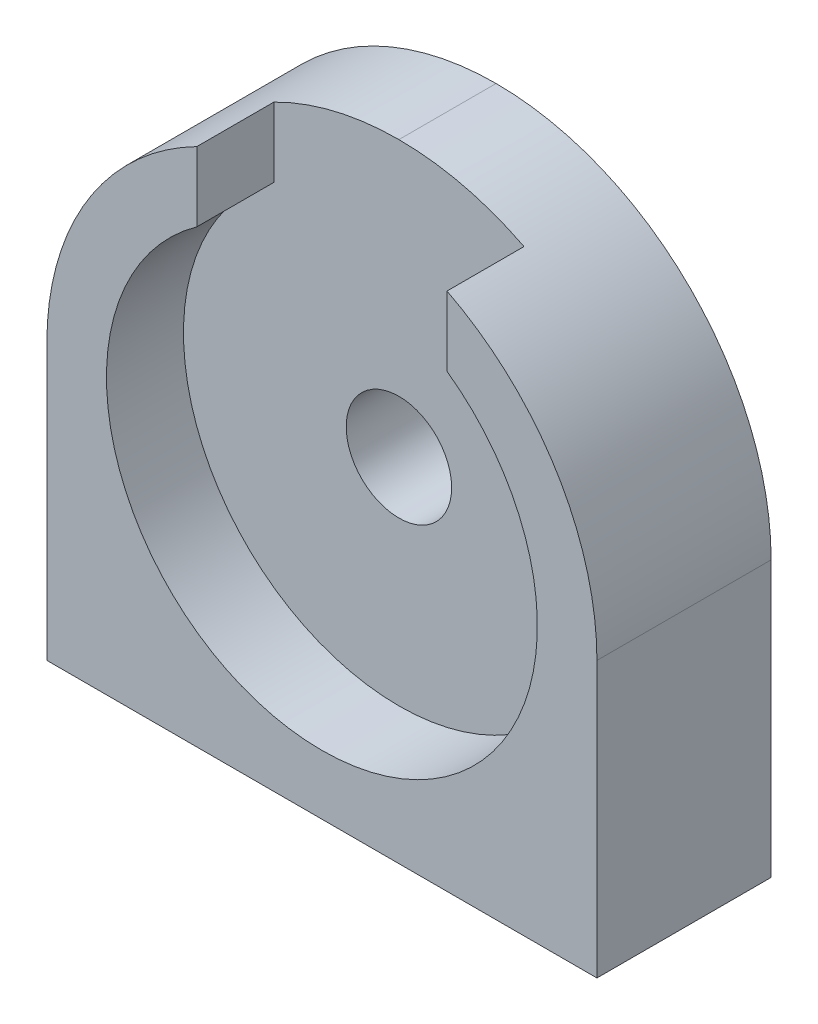
ISO-10303-21;
HEADER;
FILE_DESCRIPTION(('STEP AP214'),'2;1');
FILE_NAME('part.step','',(''),(''),'','','');
FILE_SCHEMA(('AUTOMOTIVE_DESIGN { 1 0 10303 214 1 1 1 1 }'));
ENDSEC;
DATA;
#1=APPLICATION_CONTEXT('core data for automotive mechanical design processes');
#2=APPLICATION_PROTOCOL_DEFINITION('international standard','automotive_design',2000,#1);
#3=PRODUCT_CONTEXT('',#1,'mechanical');
#4=PRODUCT('Part','Part','',(#3));
#5=PRODUCT_RELATED_PRODUCT_CATEGORY('part','',(#4));
#6=PRODUCT_DEFINITION_FORMATION('','',#4);
#7=PRODUCT_DEFINITION_CONTEXT('part definition',#1,'design');
#8=PRODUCT_DEFINITION('design','',#6,#7);
#9=PRODUCT_DEFINITION_SHAPE('','',#8);
#10=(LENGTH_UNIT() NAMED_UNIT(*) SI_UNIT(.MILLI.,.METRE.));
#11=(NAMED_UNIT(*) PLANE_ANGLE_UNIT() SI_UNIT($,.RADIAN.));
#12=(NAMED_UNIT(*) SI_UNIT($,.STERADIAN.) SOLID_ANGLE_UNIT());
#13=UNCERTAINTY_MEASURE_WITH_UNIT(LENGTH_MEASURE(1.E-05),#10,'distance_accuracy_value','');
#14=(GEOMETRIC_REPRESENTATION_CONTEXT(3) GLOBAL_UNCERTAINTY_ASSIGNED_CONTEXT((#13)) GLOBAL_UNIT_ASSIGNED_CONTEXT((#10,
#11,#12)) REPRESENTATION_CONTEXT('',''));
#15=CARTESIAN_POINT('',(0.,0.,0.));
#16=DIRECTION('',(0.,0.,1.));
#17=DIRECTION('',(1.,0.,0.));
#18=AXIS2_PLACEMENT_3D('',#15,#16,#17);
#19=CARTESIAN_POINT('',(0.,0.,25.146));
#20=DIRECTION('',(1.,0.,0.));
#21=DIRECTION('',(0.,0.,-1.));
#22=AXIS2_PLACEMENT_3D('',#19,#20,#21);
#23=PLANE('',#22);
#24=DIRECTION('',(0.,0.,-1.));
#25=VECTOR('',#24,1.);
#26=CARTESIAN_POINT('',(0.,0.,25.146));
#27=LINE('',#26,#25);
#28=CARTESIAN_POINT('',(0.,0.,4.826));
#29=VERTEX_POINT('',#28);
#30=CARTESIAN_POINT('',(0.,0.,0.));
#31=VERTEX_POINT('',#30);
#32=EDGE_CURVE('E117',#29,#31,#27,.T.);
#33=ORIENTED_EDGE('',*,*,#32,.F.);
#34=DIRECTION('',(0.,-1.,0.));
#35=VECTOR('',#34,1.);
#36=CARTESIAN_POINT('',(0.,0.,4.826));
#37=LINE('',#36,#35);
#38=CARTESIAN_POINT('',(0.,7.62,4.826));
#39=VERTEX_POINT('',#38);
#40=EDGE_CURVE('E102',#39,#29,#37,.T.);
#41=ORIENTED_EDGE('',*,*,#40,.F.);
#42=DIRECTION('',(0.,0.,-1.));
#43=VECTOR('',#42,1.);
#44=CARTESIAN_POINT('',(0.,7.62,25.146));
#45=LINE('',#44,#43);
#46=CARTESIAN_POINT('',(0.,7.62,0.));
#47=VERTEX_POINT('',#46);
#48=EDGE_CURVE('E136',#39,#47,#45,.T.);
#49=ORIENTED_EDGE('',*,*,#48,.T.);
#50=DIRECTION('',(0.,-1.,0.));
#51=VECTOR('',#50,1.);
#52=CARTESIAN_POINT('',(0.,0.,0.));
#53=LINE('',#52,#51);
#54=EDGE_CURVE('E122',#47,#31,#53,.T.);
#55=ORIENTED_EDGE('',*,*,#54,.T.);
#56=EDGE_LOOP('',(#33,#41,#49,#55));
#57=FACE_BOUND('',#56,.T.);
#58=ADVANCED_FACE('F34',(#57),#23,.F.);
#59=CARTESIAN_POINT('',(0.,0.,25.146));
#60=DIRECTION('',(0.,1.,0.));
#61=DIRECTION('',(0.,0.,1.));
#62=AXIS2_PLACEMENT_3D('',#59,#60,#61);
#63=PLANE('',#62);
#64=DIRECTION('',(0.,0.,-1.));
#65=VECTOR('',#64,1.);
#66=CARTESIAN_POINT('',(15.24,0.,25.146));
#67=LINE('',#66,#65);
#68=CARTESIAN_POINT('',(15.24,0.,4.826));
#69=VERTEX_POINT('',#68);
#70=CARTESIAN_POINT('',(15.24,0.,0.));
#71=VERTEX_POINT('',#70);
#72=EDGE_CURVE('E119',#69,#71,#67,.T.);
#73=ORIENTED_EDGE('',*,*,#72,.F.);
#74=DIRECTION('',(1.,0.,0.));
#75=VECTOR('',#74,1.);
#76=CARTESIAN_POINT('',(0.,0.,4.826));
#77=LINE('',#76,#75);
#78=EDGE_CURVE('E105',#29,#69,#77,.T.);
#79=ORIENTED_EDGE('',*,*,#78,.F.);
#80=ORIENTED_EDGE('',*,*,#32,.T.);
#81=DIRECTION('',(1.,0.,0.));
#82=VECTOR('',#81,1.);
#83=CARTESIAN_POINT('',(0.,0.,0.));
#84=LINE('',#83,#82);
#85=EDGE_CURVE('E183',#31,#71,#84,.T.);
#86=ORIENTED_EDGE('',*,*,#85,.T.);
#87=EDGE_LOOP('',(#73,#79,#80,#86));
#88=FACE_BOUND('',#87,.T.);
#89=ADVANCED_FACE('F115',(#88),#63,.F.);
#90=CARTESIAN_POINT('',(15.24,0.,25.146));
#91=DIRECTION('',(-1.,0.,0.));
#92=DIRECTION('',(0.,0.,1.));
#93=AXIS2_PLACEMENT_3D('',#90,#91,#92);
#94=PLANE('',#93);
#95=DIRECTION('',(0.,0.,-1.));
#96=VECTOR('',#95,1.);
#97=CARTESIAN_POINT('',(15.24,7.62,25.146));
#98=LINE('',#97,#96);
#99=CARTESIAN_POINT('',(15.24,7.62,0.));
#100=VERTEX_POINT('',#99);
#101=CARTESIAN_POINT('',(15.24,7.62,4.826));
#102=VERTEX_POINT('',#101);
#103=EDGE_CURVE('E133',#100,#102,#98,.F.);
#104=ORIENTED_EDGE('',*,*,#103,.T.);
#105=DIRECTION('',(0.,-1.,0.));
#106=VECTOR('',#105,1.);
#107=CARTESIAN_POINT('',(15.24,0.,4.826));
#108=LINE('',#107,#106);
#109=EDGE_CURVE('E165',#102,#69,#108,.T.);
#110=ORIENTED_EDGE('',*,*,#109,.T.);
#111=ORIENTED_EDGE('',*,*,#72,.T.);
#112=DIRECTION('',(0.,1.,0.));
#113=VECTOR('',#112,1.);
#114=CARTESIAN_POINT('',(15.24,0.,0.));
#115=LINE('',#114,#113);
#116=EDGE_CURVE('E128',#71,#100,#115,.T.);
#117=ORIENTED_EDGE('',*,*,#116,.T.);
#118=EDGE_LOOP('',(#104,#110,#111,#117));
#119=FACE_BOUND('',#118,.T.);
#120=ADVANCED_FACE('F188',(#119),#94,.F.);
#121=CARTESIAN_POINT('',(0.,0.,0.));
#122=DIRECTION('',(0.,0.,-1.));
#123=DIRECTION('',(-1.,0.,0.));
#124=AXIS2_PLACEMENT_3D('',#121,#122,#123);
#125=PLANE('',#124);
#126=CARTESIAN_POINT('',(7.62,7.61999999999998,0.));
#127=DIRECTION('',(0.,0.,1.));
#128=DIRECTION('',(1.,0.,0.));
#129=AXIS2_PLACEMENT_3D('',#126,#127,#128);
#130=CIRCLE('',#129,1.4605);
#131=CARTESIAN_POINT('',(9.0805,7.61999999999998,0.));
#132=VERTEX_POINT('',#131);
#133=EDGE_CURVE('E163',#132,#132,#130,.T.);
#134=ORIENTED_EDGE('',*,*,#133,.T.);
#135=EDGE_LOOP('',(#134));
#136=FACE_BOUND('',#135,.T.);
#137=CARTESIAN_POINT('',(7.62,7.62,0.));
#138=DIRECTION('',(0.,0.,-1.));
#139=DIRECTION('',(-1.,0.,0.));
#140=AXIS2_PLACEMENT_3D('',#137,#138,#139);
#141=CIRCLE('',#140,7.62);
#142=CARTESIAN_POINT('',(7.62,15.24,0.));
#143=VERTEX_POINT('',#142);
#144=EDGE_CURVE('E124',#47,#143,#141,.T.);
#145=ORIENTED_EDGE('',*,*,#144,.T.);
#146=CARTESIAN_POINT('',(7.62,7.62,0.));
#147=DIRECTION('',(0.,0.,-1.));
#148=DIRECTION('',(-1.,0.,0.));
#149=AXIS2_PLACEMENT_3D('',#146,#147,#148);
#150=CIRCLE('',#149,7.62);
#151=EDGE_CURVE('E126',#143,#100,#150,.T.);
#152=ORIENTED_EDGE('',*,*,#151,.T.);
#153=ORIENTED_EDGE('',*,*,#116,.F.);
#154=ORIENTED_EDGE('',*,*,#85,.F.);
#155=ORIENTED_EDGE('',*,*,#54,.F.);
#156=EDGE_LOOP('',(#145,#152,#153,#154,#155));
#157=FACE_BOUND('',#156,.T.);
#158=ADVANCED_FACE('F204',(#136,#157),#125,.T.);
#159=CARTESIAN_POINT('',(7.62,7.62,2.6924));
#160=DIRECTION('',(0.,0.,1.));
#161=DIRECTION('',(1.,0.,0.));
#162=AXIS2_PLACEMENT_3D('',#159,#160,#161);
#163=CYLINDRICAL_SURFACE('',#162,5.969);
#164=DIRECTION('',(0.,0.,1.));
#165=VECTOR('',#164,1.);
#166=CARTESIAN_POINT('',(4.15421620917245,12.4797637509695,-4.90925537407099));
#167=LINE('',#166,#165);
#168=CARTESIAN_POINT('',(4.15421620917245,12.4797637509695,2.6924));
#169=VERTEX_POINT('',#168);
#170=CARTESIAN_POINT('',(4.15421620917245,12.4797637509695,4.826));
#171=VERTEX_POINT('',#170);
#172=EDGE_CURVE('E170',#169,#171,#167,.T.);
#173=ORIENTED_EDGE('',*,*,#172,.T.);
#174=CARTESIAN_POINT('',(7.62,7.62,4.826));
#175=DIRECTION('',(0.,0.,-1.));
#176=DIRECTION('',(-1.,0.,0.));
#177=AXIS2_PLACEMENT_3D('',#174,#175,#176);
#178=CIRCLE('',#177,5.969);
#179=CARTESIAN_POINT('',(11.0857837908275,12.4797637509695,4.826));
#180=VERTEX_POINT('',#179);
#181=EDGE_CURVE('E193',#171,#180,#178,.F.);
#182=ORIENTED_EDGE('',*,*,#181,.T.);
#183=DIRECTION('',(0.,0.,1.));
#184=VECTOR('',#183,1.);
#185=CARTESIAN_POINT('',(11.0857837908275,12.4797637509695,-4.90925537407099));
#186=LINE('',#185,#184);
#187=CARTESIAN_POINT('',(11.0857837908275,12.4797637509695,2.6924));
#188=VERTEX_POINT('',#187);
#189=EDGE_CURVE('E174',#188,#180,#186,.T.);
#190=ORIENTED_EDGE('',*,*,#189,.F.);
#191=CARTESIAN_POINT('',(7.62,7.62,2.6924));
#192=DIRECTION('',(0.,0.,1.));
#193=DIRECTION('',(1.,0.,0.));
#194=AXIS2_PLACEMENT_3D('',#191,#192,#193);
#195=CIRCLE('',#194,5.969);
#196=EDGE_CURVE('E142',#169,#188,#195,.T.);
#197=ORIENTED_EDGE('',*,*,#196,.F.);
#198=EDGE_LOOP('',(#173,#182,#190,#197));
#199=FACE_BOUND('',#198,.T.);
#200=ADVANCED_FACE('F199',(#199),#163,.F.);
#201=CARTESIAN_POINT('',(7.62,7.62,2.6924));
#202=DIRECTION('',(0.,0.,1.));
#203=DIRECTION('',(1.,0.,0.));
#204=AXIS2_PLACEMENT_3D('',#201,#202,#203);
#205=PLANE('',#204);
#206=CARTESIAN_POINT('',(7.62,7.61999999999998,2.6924));
#207=DIRECTION('',(0.,0.,1.));
#208=DIRECTION('',(1.,0.,0.));
#209=AXIS2_PLACEMENT_3D('',#206,#207,#208);
#210=CIRCLE('',#209,1.4605);
#211=CARTESIAN_POINT('',(9.0805,7.61999999999998,2.6924));
#212=VERTEX_POINT('',#211);
#213=EDGE_CURVE('E160',#212,#212,#210,.T.);
#214=ORIENTED_EDGE('',*,*,#213,.F.);
#215=EDGE_LOOP('',(#214));
#216=FACE_BOUND('',#215,.T.);
#217=ORIENTED_EDGE('',*,*,#196,.T.);
#218=DIRECTION('',(0.,-1.,0.));
#219=VECTOR('',#218,1.);
#220=CARTESIAN_POINT('',(11.0857837908275,12.4797637509695,2.6924));
#221=LINE('',#220,#219);
#222=CARTESIAN_POINT('',(11.0857837908275,14.4062171137709,2.6924));
#223=VERTEX_POINT('',#222);
#224=EDGE_CURVE('E172',#223,#188,#221,.T.);
#225=ORIENTED_EDGE('',*,*,#224,.F.);
#226=CARTESIAN_POINT('',(7.62,7.62,2.6924));
#227=DIRECTION('',(0.,0.,1.));
#228=DIRECTION('',(1.,0.,0.));
#229=AXIS2_PLACEMENT_3D('',#226,#227,#228);
#230=CIRCLE('',#229,7.62);
#231=CARTESIAN_POINT('',(7.62,15.24,2.6924));
#232=VERTEX_POINT('',#231);
#233=EDGE_CURVE('E138',#232,#223,#230,.F.);
#234=ORIENTED_EDGE('',*,*,#233,.F.);
#235=CARTESIAN_POINT('',(7.62,7.62,2.6924));
#236=DIRECTION('',(0.,0.,1.));
#237=DIRECTION('',(1.,0.,0.));
#238=AXIS2_PLACEMENT_3D('',#235,#236,#237);
#239=CIRCLE('',#238,7.62);
#240=CARTESIAN_POINT('',(4.15421620917245,14.4062171137709,2.6924));
#241=VERTEX_POINT('',#240);
#242=EDGE_CURVE('E143',#241,#232,#239,.F.);
#243=ORIENTED_EDGE('',*,*,#242,.F.);
#244=DIRECTION('',(0.,1.,0.));
#245=VECTOR('',#244,1.);
#246=CARTESIAN_POINT('',(4.15421620917245,12.4797637509695,2.6924));
#247=LINE('',#246,#245);
#248=EDGE_CURVE('E155',#169,#241,#247,.T.);
#249=ORIENTED_EDGE('',*,*,#248,.F.);
#250=EDGE_LOOP('',(#217,#225,#234,#243,#249));
#251=FACE_BOUND('',#250,.T.);
#252=ADVANCED_FACE('F203',(#216,#251),#205,.T.);
#253=CARTESIAN_POINT('',(7.62,7.62,25.146));
#254=DIRECTION('',(0.,0.,-1.));
#255=DIRECTION('',(-1.,0.,0.));
#256=AXIS2_PLACEMENT_3D('',#253,#254,#255);
#257=CYLINDRICAL_SURFACE('',#256,7.62);
#258=CARTESIAN_POINT('',(7.62,7.62,4.826));
#259=DIRECTION('',(0.,0.,-1.));
#260=DIRECTION('',(-1.,0.,0.));
#261=AXIS2_PLACEMENT_3D('',#258,#259,#260);
#262=CIRCLE('',#261,7.62);
#263=CARTESIAN_POINT('',(4.15421620917245,14.4062171137709,4.826));
#264=VERTEX_POINT('',#263);
#265=EDGE_CURVE('E108',#264,#39,#262,.F.);
#266=ORIENTED_EDGE('',*,*,#265,.F.);
#267=DIRECTION('',(0.,0.,-1.));
#268=VECTOR('',#267,1.);
#269=CARTESIAN_POINT('',(4.15421620917245,14.4062171137709,25.146));
#270=LINE('',#269,#268);
#271=EDGE_CURVE('E42',#241,#264,#270,.F.);
#272=ORIENTED_EDGE('',*,*,#271,.F.);
#273=ORIENTED_EDGE('',*,*,#242,.T.);
#274=DIRECTION('',(0.,0.,-1.));
#275=VECTOR('',#274,1.);
#276=CARTESIAN_POINT('',(7.62,15.24,25.146));
#277=LINE('',#276,#275);
#278=EDGE_CURVE('E139',#143,#232,#277,.F.);
#279=ORIENTED_EDGE('',*,*,#278,.F.);
#280=ORIENTED_EDGE('',*,*,#144,.F.);
#281=ORIENTED_EDGE('',*,*,#48,.F.);
#282=EDGE_LOOP('',(#266,#272,#273,#279,#280,#281));
#283=FACE_BOUND('',#282,.T.);
#284=ADVANCED_FACE('F36',(#283),#257,.T.);
#285=CARTESIAN_POINT('',(7.62,7.62,25.146));
#286=DIRECTION('',(0.,0.,-1.));
#287=DIRECTION('',(-1.,0.,0.));
#288=AXIS2_PLACEMENT_3D('',#285,#286,#287);
#289=CYLINDRICAL_SURFACE('',#288,7.62);
#290=CARTESIAN_POINT('',(7.62,7.62,4.826));
#291=DIRECTION('',(0.,0.,-1.));
#292=DIRECTION('',(-1.,0.,0.));
#293=AXIS2_PLACEMENT_3D('',#290,#291,#292);
#294=CIRCLE('',#293,7.62);
#295=CARTESIAN_POINT('',(11.0857837908275,14.4062171137709,4.826));
#296=VERTEX_POINT('',#295);
#297=EDGE_CURVE('E49',#102,#296,#294,.F.);
#298=ORIENTED_EDGE('',*,*,#297,.F.);
#299=ORIENTED_EDGE('',*,*,#103,.F.);
#300=ORIENTED_EDGE('',*,*,#151,.F.);
#301=ORIENTED_EDGE('',*,*,#278,.T.);
#302=ORIENTED_EDGE('',*,*,#233,.T.);
#303=DIRECTION('',(0.,0.,-1.));
#304=VECTOR('',#303,1.);
#305=CARTESIAN_POINT('',(11.0857837908275,14.4062171137709,25.146));
#306=LINE('',#305,#304);
#307=EDGE_CURVE('E55',#296,#223,#306,.T.);
#308=ORIENTED_EDGE('',*,*,#307,.F.);
#309=EDGE_LOOP('',(#298,#299,#300,#301,#302,#308));
#310=FACE_BOUND('',#309,.T.);
#311=ADVANCED_FACE('F192',(#310),#289,.T.);
#312=CARTESIAN_POINT('',(4.15421620917245,12.4797637509695,-4.90925537407099));
#313=DIRECTION('',(-1.,0.,0.));
#314=DIRECTION('',(0.,0.,1.));
#315=AXIS2_PLACEMENT_3D('',#312,#313,#314);
#316=PLANE('',#315);
#317=ORIENTED_EDGE('',*,*,#271,.T.);
#318=DIRECTION('',(0.,-1.,0.));
#319=VECTOR('',#318,1.);
#320=CARTESIAN_POINT('',(4.15421620917245,12.4797637509695,4.826));
#321=LINE('',#320,#319);
#322=EDGE_CURVE('E153',#264,#171,#321,.T.);
#323=ORIENTED_EDGE('',*,*,#322,.T.);
#324=ORIENTED_EDGE('',*,*,#172,.F.);
#325=ORIENTED_EDGE('',*,*,#248,.T.);
#326=EDGE_LOOP('',(#317,#323,#324,#325));
#327=FACE_BOUND('',#326,.T.);
#328=ADVANCED_FACE('F151',(#327),#316,.F.);
#329=CARTESIAN_POINT('',(11.0857837908275,12.4797637509695,-4.90925537407099));
#330=DIRECTION('',(1.,0.,0.));
#331=DIRECTION('',(0.,0.,-1.));
#332=AXIS2_PLACEMENT_3D('',#329,#330,#331);
#333=PLANE('',#332);
#334=ORIENTED_EDGE('',*,*,#189,.T.);
#335=DIRECTION('',(0.,1.,0.));
#336=VECTOR('',#335,1.);
#337=CARTESIAN_POINT('',(11.0857837908275,12.4797637509695,4.826));
#338=LINE('',#337,#336);
#339=EDGE_CURVE('E11',#180,#296,#338,.T.);
#340=ORIENTED_EDGE('',*,*,#339,.T.);
#341=ORIENTED_EDGE('',*,*,#307,.T.);
#342=ORIENTED_EDGE('',*,*,#224,.T.);
#343=EDGE_LOOP('',(#334,#340,#341,#342));
#344=FACE_BOUND('',#343,.T.);
#345=ADVANCED_FACE('F201',(#344),#333,.F.);
#346=CARTESIAN_POINT('',(7.62,7.61999999999998,0.));
#347=DIRECTION('',(0.,0.,1.));
#348=DIRECTION('',(1.,0.,0.));
#349=AXIS2_PLACEMENT_3D('',#346,#347,#348);
#350=CYLINDRICAL_SURFACE('',#349,1.4605);
#351=ORIENTED_EDGE('',*,*,#133,.F.);
#352=EDGE_LOOP('',(#351));
#353=FACE_BOUND('',#352,.T.);
#354=ORIENTED_EDGE('',*,*,#213,.T.);
#355=EDGE_LOOP('',(#354));
#356=FACE_BOUND('',#355,.T.);
#357=ADVANCED_FACE('F237',(#353,#356),#350,.F.);
#358=CARTESIAN_POINT('',(0.,0.,4.826));
#359=DIRECTION('',(0.,0.,-1.));
#360=DIRECTION('',(-1.,0.,0.));
#361=AXIS2_PLACEMENT_3D('',#358,#359,#360);
#362=PLANE('',#361);
#363=ORIENTED_EDGE('',*,*,#265,.T.);
#364=ORIENTED_EDGE('',*,*,#40,.T.);
#365=ORIENTED_EDGE('',*,*,#78,.T.);
#366=ORIENTED_EDGE('',*,*,#109,.F.);
#367=ORIENTED_EDGE('',*,*,#297,.T.);
#368=ORIENTED_EDGE('',*,*,#339,.F.);
#369=ORIENTED_EDGE('',*,*,#181,.F.);
#370=ORIENTED_EDGE('',*,*,#322,.F.);
#371=EDGE_LOOP('',(#363,#364,#365,#366,#367,#368,#369,#370));
#372=FACE_BOUND('',#371,.T.);
#373=ADVANCED_FACE('F104',(#372),#362,.F.);
#374=CLOSED_SHELL('',(#58,#89,#120,#158,#200,#252,#284,#311,#328,#345,#357,#373));
#375=MANIFOLD_SOLID_BREP('B2',#374);
#376=ADVANCED_BREP_SHAPE_REPRESENTATION('',(#18,#375),#14);
#377=SHAPE_DEFINITION_REPRESENTATION(#9,#376);
ENDSEC;
END-ISO-10303-21;
